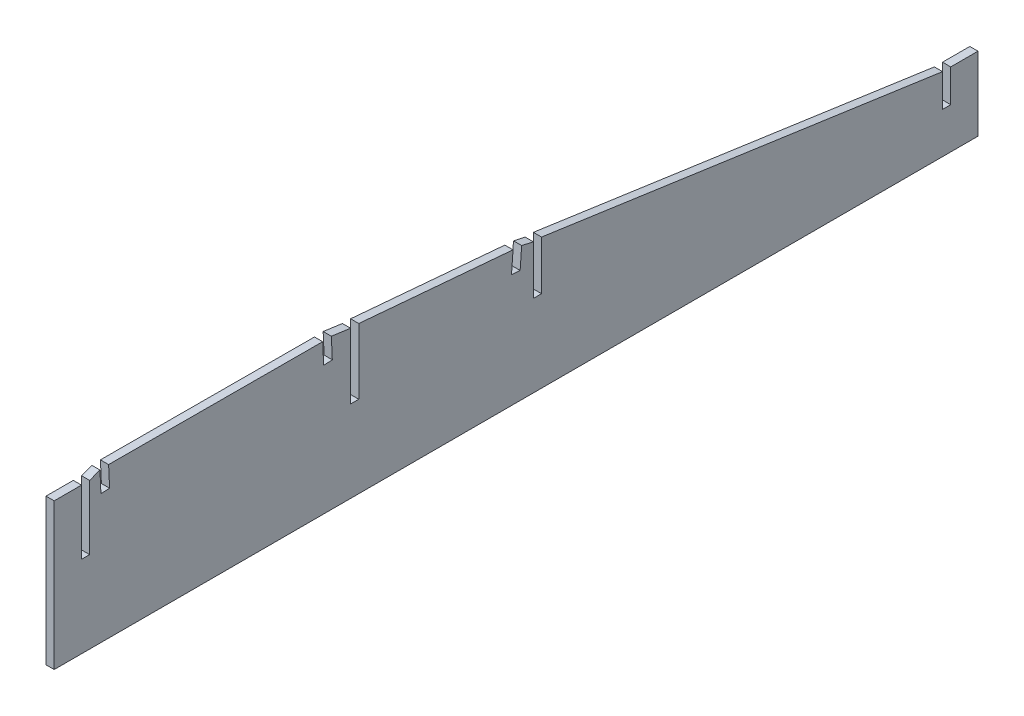
ISO-10303-21;
HEADER;
FILE_DESCRIPTION(('STEP AP214'),'2;1');
FILE_NAME('part.step','',(''),(''),'','','');
FILE_SCHEMA(('AUTOMOTIVE_DESIGN { 1 0 10303 214 1 1 1 1 }'));
ENDSEC;
DATA;
#1=APPLICATION_CONTEXT('core data for automotive mechanical design processes');
#2=APPLICATION_PROTOCOL_DEFINITION('international standard','automotive_design',2000,#1);
#3=PRODUCT_CONTEXT('',#1,'mechanical');
#4=PRODUCT('Part','Part','',(#3));
#5=PRODUCT_RELATED_PRODUCT_CATEGORY('part','',(#4));
#6=PRODUCT_DEFINITION_FORMATION('','',#4);
#7=PRODUCT_DEFINITION_CONTEXT('part definition',#1,'design');
#8=PRODUCT_DEFINITION('design','',#6,#7);
#9=PRODUCT_DEFINITION_SHAPE('','',#8);
#10=(LENGTH_UNIT() NAMED_UNIT(*) SI_UNIT(.MILLI.,.METRE.));
#11=(NAMED_UNIT(*) PLANE_ANGLE_UNIT() SI_UNIT($,.RADIAN.));
#12=(NAMED_UNIT(*) SI_UNIT($,.STERADIAN.) SOLID_ANGLE_UNIT());
#13=UNCERTAINTY_MEASURE_WITH_UNIT(LENGTH_MEASURE(1.E-05),#10,'distance_accuracy_value','');
#14=(GEOMETRIC_REPRESENTATION_CONTEXT(3) GLOBAL_UNCERTAINTY_ASSIGNED_CONTEXT((#13)) GLOBAL_UNIT_ASSIGNED_CONTEXT((#10,
#11,#12)) REPRESENTATION_CONTEXT('',''));
#15=CARTESIAN_POINT('',(0.,0.,0.));
#16=DIRECTION('',(0.,0.,1.));
#17=DIRECTION('',(1.,0.,0.));
#18=AXIS2_PLACEMENT_3D('',#15,#16,#17);
#19=CARTESIAN_POINT('',(296.875,70.0057688647873,-257.342966201798));
#20=DIRECTION('',(0.,0.937794060032995,0.347192023190095));
#21=DIRECTION('',(0.,-0.347192023190095,0.937794060032995));
#22=AXIS2_PLACEMENT_3D('',#19,#20,#21);
#23=PLANE('',#22);
#24=DIRECTION('',(0.,-0.347192023190095,0.937794060032995));
#25=VECTOR('',#24,1.);
#26=CARTESIAN_POINT('',(299.875,70.0057688647873,-257.342966201798));
#27=LINE('',#26,#25);
#28=CARTESIAN_POINT('',(299.875,71.404391483129,-261.120760321769));
#29=VERTEX_POINT('',#28);
#30=CARTESIAN_POINT('',(299.875,70.0057688647873,-257.342966201798));
#31=VERTEX_POINT('',#30);
#32=EDGE_CURVE('E274',#29,#31,#27,.T.);
#33=ORIENTED_EDGE('',*,*,#32,.F.);
#34=DIRECTION('',(1.,0.,0.));
#35=VECTOR('',#34,1.);
#36=CARTESIAN_POINT('',(296.875,71.404391483129,-261.120760321769));
#37=LINE('',#36,#35);
#38=CARTESIAN_POINT('',(296.875,71.404391483129,-261.120760321769));
#39=VERTEX_POINT('',#38);
#40=EDGE_CURVE('E11',#39,#29,#37,.T.);
#41=ORIENTED_EDGE('',*,*,#40,.F.);
#42=DIRECTION('',(0.,-0.347192023190095,0.937794060032995));
#43=VECTOR('',#42,1.);
#44=CARTESIAN_POINT('',(296.875,70.0057688647873,-257.342966201798));
#45=LINE('',#44,#43);
#46=CARTESIAN_POINT('',(296.875,70.0057688647873,-257.342966201798));
#47=VERTEX_POINT('',#46);
#48=EDGE_CURVE('E366',#39,#47,#45,.T.);
#49=ORIENTED_EDGE('',*,*,#48,.T.);
#50=DIRECTION('',(1.,0.,0.));
#51=VECTOR('',#50,1.);
#52=CARTESIAN_POINT('',(296.875,70.0057688647873,-257.342966201798));
#53=LINE('',#52,#51);
#54=EDGE_CURVE('E36',#47,#31,#53,.T.);
#55=ORIENTED_EDGE('',*,*,#54,.T.);
#56=EDGE_LOOP('',(#33,#41,#49,#55));
#57=FACE_BOUND('',#56,.T.);
#58=ADVANCED_FACE('F33',(#57),#23,.T.);
#59=CARTESIAN_POINT('',(296.875,63.7075916354395,-261.478925383067));
#60=DIRECTION('',(0.,0.0464839809617224,-0.998919035514866));
#61=DIRECTION('',(0.,0.998919035514866,0.0464839809617224));
#62=AXIS2_PLACEMENT_3D('',#59,#60,#61);
#63=PLANE('',#62);
#64=DIRECTION('',(0.,0.998919035514866,0.0464839809617224));
#65=VECTOR('',#64,1.);
#66=CARTESIAN_POINT('',(299.875,63.7075916354395,-261.478925383067));
#67=LINE('',#66,#65);
#68=CARTESIAN_POINT('',(299.875,63.7075916354395,-261.478925383067));
#69=VERTEX_POINT('',#68);
#70=EDGE_CURVE('E364',#69,#29,#67,.T.);
#71=ORIENTED_EDGE('',*,*,#70,.F.);
#72=DIRECTION('',(1.,0.,0.));
#73=VECTOR('',#72,1.);
#74=CARTESIAN_POINT('',(296.875,63.7075916354395,-261.478925383067));
#75=LINE('',#74,#73);
#76=CARTESIAN_POINT('',(296.875,63.7075916354395,-261.478925383067));
#77=VERTEX_POINT('',#76);
#78=EDGE_CURVE('E42',#77,#69,#75,.T.);
#79=ORIENTED_EDGE('',*,*,#78,.F.);
#80=DIRECTION('',(0.,0.998919035514866,0.0464839809617224));
#81=VECTOR('',#80,1.);
#82=CARTESIAN_POINT('',(296.875,63.7075916354395,-261.478925383067));
#83=LINE('',#82,#81);
#84=EDGE_CURVE('E264',#77,#39,#83,.T.);
#85=ORIENTED_EDGE('',*,*,#84,.T.);
#86=ORIENTED_EDGE('',*,*,#40,.T.);
#87=EDGE_LOOP('',(#71,#79,#85,#86));
#88=FACE_BOUND('',#87,.T.);
#89=ADVANCED_FACE('F426',(#88),#63,.T.);
#90=CARTESIAN_POINT('',(296.875,63.7075916354395,-261.478925383067));
#91=DIRECTION('',(0.,0.998919219508705,0.0464800268515444));
#92=DIRECTION('',(0.,-0.0464800268515444,0.998919219508705));
#93=AXIS2_PLACEMENT_3D('',#90,#91,#92);
#94=PLANE('',#93);
#95=DIRECTION('',(0.,-0.0464800268515444,0.998919219508705));
#96=VECTOR('',#95,1.);
#97=CARTESIAN_POINT('',(299.875,63.7075916354395,-261.478925383067));
#98=LINE('',#97,#96);
#99=CARTESIAN_POINT('',(299.875,63.8551657207983,-264.650493907267));
#100=VERTEX_POINT('',#99);
#101=EDGE_CURVE('E251',#100,#69,#98,.T.);
#102=ORIENTED_EDGE('',*,*,#101,.F.);
#103=DIRECTION('',(1.,0.,0.));
#104=VECTOR('',#103,1.);
#105=CARTESIAN_POINT('',(296.875,63.8551657207983,-264.650493907267));
#106=LINE('',#105,#104);
#107=CARTESIAN_POINT('',(296.875,63.8551657207983,-264.650493907267));
#108=VERTEX_POINT('',#107);
#109=EDGE_CURVE('E246',#108,#100,#106,.T.);
#110=ORIENTED_EDGE('',*,*,#109,.F.);
#111=DIRECTION('',(0.,-0.0464800268515444,0.998919219508705));
#112=VECTOR('',#111,1.);
#113=CARTESIAN_POINT('',(296.875,63.7075916354395,-261.478925383067));
#114=LINE('',#113,#112);
#115=EDGE_CURVE('E249',#108,#77,#114,.T.);
#116=ORIENTED_EDGE('',*,*,#115,.T.);
#117=ORIENTED_EDGE('',*,*,#78,.T.);
#118=EDGE_LOOP('',(#102,#110,#116,#117));
#119=FACE_BOUND('',#118,.T.);
#120=ADVANCED_FACE('F248',(#119),#94,.T.);
#121=CARTESIAN_POINT('',(296.875,63.8551657207983,-264.650493907267));
#122=DIRECTION('',(0.,-0.0464839809616975,0.998919035514867));
#123=DIRECTION('',(0.,-0.998919035514867,-0.0464839809616975));
#124=AXIS2_PLACEMENT_3D('',#121,#122,#123);
#125=PLANE('',#124);
#126=DIRECTION('',(0.,-0.998919035514867,-0.0464839809616975));
#127=VECTOR('',#126,1.);
#128=CARTESIAN_POINT('',(299.875,63.8551657207983,-264.650493907267));
#129=LINE('',#128,#127);
#130=CARTESIAN_POINT('',(299.875,71.5519651854514,-264.292328863794));
#131=VERTEX_POINT('',#130);
#132=EDGE_CURVE('E361',#131,#100,#129,.T.);
#133=ORIENTED_EDGE('',*,*,#132,.F.);
#134=DIRECTION('',(1.,0.,0.));
#135=VECTOR('',#134,1.);
#136=CARTESIAN_POINT('',(296.875,71.5519651854514,-264.292328863794));
#137=LINE('',#136,#135);
#138=CARTESIAN_POINT('',(296.875,71.5519651854514,-264.292328863794));
#139=VERTEX_POINT('',#138);
#140=EDGE_CURVE('E256',#139,#131,#137,.T.);
#141=ORIENTED_EDGE('',*,*,#140,.F.);
#142=DIRECTION('',(0.,-0.998919035514867,-0.0464839809616975));
#143=VECTOR('',#142,1.);
#144=CARTESIAN_POINT('',(296.875,63.8551657207983,-264.650493907267));
#145=LINE('',#144,#143);
#146=EDGE_CURVE('E262',#139,#108,#145,.T.);
#147=ORIENTED_EDGE('',*,*,#146,.T.);
#148=ORIENTED_EDGE('',*,*,#109,.T.);
#149=EDGE_LOOP('',(#133,#141,#147,#148));
#150=FACE_BOUND('',#149,.T.);
#151=ADVANCED_FACE('F266',(#150),#125,.T.);
#152=CARTESIAN_POINT('',(296.875,71.5519651854514,-264.292328863794));
#153=DIRECTION('',(0.,0.999995706466533,-0.00293036661511788));
#154=DIRECTION('',(0.,0.00293036661511788,0.999995706466533));
#155=AXIS2_PLACEMENT_3D('',#152,#153,#154);
#156=PLANE('',#155);
#157=DIRECTION('',(0.,0.00293036661511788,0.999995706466533));
#158=VECTOR('',#157,1.);
#159=CARTESIAN_POINT('',(299.875,71.5519651854514,-264.292328863794));
#160=LINE('',#159,#158);
#161=CARTESIAN_POINT('',(299.875,71.3219901959792,-342.771929634712));
#162=VERTEX_POINT('',#161);
#163=EDGE_CURVE('E358',#162,#131,#160,.T.);
#164=ORIENTED_EDGE('',*,*,#163,.F.);
#165=DIRECTION('',(1.,0.,0.));
#166=VECTOR('',#165,1.);
#167=CARTESIAN_POINT('',(296.875,71.3219901959792,-342.771929634712));
#168=LINE('',#167,#166);
#169=CARTESIAN_POINT('',(296.875,71.3219901959792,-342.771929634712));
#170=VERTEX_POINT('',#169);
#171=EDGE_CURVE('E370',#170,#162,#168,.T.);
#172=ORIENTED_EDGE('',*,*,#171,.F.);
#173=DIRECTION('',(0.,0.00293036661511788,0.999995706466533));
#174=VECTOR('',#173,1.);
#175=CARTESIAN_POINT('',(296.875,71.5519651854514,-264.292328863794));
#176=LINE('',#175,#174);
#177=EDGE_CURVE('E267',#170,#139,#176,.T.);
#178=ORIENTED_EDGE('',*,*,#177,.T.);
#179=ORIENTED_EDGE('',*,*,#140,.T.);
#180=EDGE_LOOP('',(#164,#172,#178,#179));
#181=FACE_BOUND('',#180,.T.);
#182=ADVANCED_FACE('F439',(#181),#156,.T.);
#183=CARTESIAN_POINT('',(296.875,63.650911904459,-343.128897761839));
#184=DIRECTION('',(0.,0.0464839809617224,-0.998919035514866));
#185=DIRECTION('',(0.,0.998919035514866,0.0464839809617224));
#186=AXIS2_PLACEMENT_3D('',#183,#184,#185);
#187=PLANE('',#186);
#188=DIRECTION('',(0.,0.998919035514866,0.0464839809617224));
#189=VECTOR('',#188,1.);
#190=CARTESIAN_POINT('',(299.875,63.650911904459,-343.128897761839));
#191=LINE('',#190,#189);
#192=CARTESIAN_POINT('',(299.875,63.650911904459,-343.128897761839));
#193=VERTEX_POINT('',#192);
#194=EDGE_CURVE('E355',#193,#162,#191,.T.);
#195=ORIENTED_EDGE('',*,*,#194,.F.);
#196=DIRECTION('',(1.,0.,0.));
#197=VECTOR('',#196,1.);
#198=CARTESIAN_POINT('',(296.875,63.650911904459,-343.128897761839));
#199=LINE('',#198,#197);
#200=CARTESIAN_POINT('',(296.875,63.650911904459,-343.128897761839));
#201=VERTEX_POINT('',#200);
#202=EDGE_CURVE('E372',#201,#193,#199,.T.);
#203=ORIENTED_EDGE('',*,*,#202,.F.);
#204=DIRECTION('',(0.,0.998919035514866,0.0464839809617224));
#205=VECTOR('',#204,1.);
#206=CARTESIAN_POINT('',(296.875,63.650911904459,-343.128897761839));
#207=LINE('',#206,#205);
#208=EDGE_CURVE('E269',#201,#170,#207,.T.);
#209=ORIENTED_EDGE('',*,*,#208,.T.);
#210=ORIENTED_EDGE('',*,*,#171,.T.);
#211=EDGE_LOOP('',(#195,#203,#209,#210));
#212=FACE_BOUND('',#211,.T.);
#213=ADVANCED_FACE('F442',(#212),#187,.T.);
#214=CARTESIAN_POINT('',(296.875,63.650911904459,-343.128897761839));
#215=DIRECTION('',(0.,0.998919034759445,0.0464839971953607));
#216=DIRECTION('',(0.,-0.0464839971953607,0.998919034759445));
#217=AXIS2_PLACEMENT_3D('',#214,#215,#216);
#218=PLANE('',#217);
#219=DIRECTION('',(0.,-0.0464839971953607,0.998919034759445));
#220=VECTOR('',#219,1.);
#221=CARTESIAN_POINT('',(299.875,63.650911904459,-343.128897761839));
#222=LINE('',#221,#220);
#223=CARTESIAN_POINT('',(299.875,63.7984985956583,-346.300465699436));
#224=VERTEX_POINT('',#223);
#225=EDGE_CURVE('E352',#224,#193,#222,.T.);
#226=ORIENTED_EDGE('',*,*,#225,.F.);
#227=DIRECTION('',(1.,0.,0.));
#228=VECTOR('',#227,1.);
#229=CARTESIAN_POINT('',(296.875,63.7984985956583,-346.300465699436));
#230=LINE('',#229,#228);
#231=CARTESIAN_POINT('',(296.875,63.7984985956583,-346.300465699436));
#232=VERTEX_POINT('',#231);
#233=EDGE_CURVE('E374',#232,#224,#230,.T.);
#234=ORIENTED_EDGE('',*,*,#233,.F.);
#235=DIRECTION('',(0.,-0.0464839971953607,0.998919034759445));
#236=VECTOR('',#235,1.);
#237=CARTESIAN_POINT('',(296.875,63.650911904459,-343.128897761839));
#238=LINE('',#237,#236);
#239=EDGE_CURVE('E845',#232,#201,#238,.T.);
#240=ORIENTED_EDGE('',*,*,#239,.T.);
#241=ORIENTED_EDGE('',*,*,#202,.T.);
#242=EDGE_LOOP('',(#226,#234,#240,#241));
#243=FACE_BOUND('',#242,.T.);
#244=ADVANCED_FACE('F446',(#243),#218,.T.);
#245=CARTESIAN_POINT('',(296.875,63.7984985956583,-346.300465699436));
#246=DIRECTION('',(0.,-0.0464839809617478,0.998919035514865));
#247=DIRECTION('',(0.,-0.998919035514865,-0.0464839809617478));
#248=AXIS2_PLACEMENT_3D('',#245,#246,#247);
#249=PLANE('',#248);
#250=DIRECTION('',(0.,-0.998919035514865,-0.0464839809617478));
#251=VECTOR('',#250,1.);
#252=CARTESIAN_POINT('',(299.875,63.7984985956583,-346.300465699436));
#253=LINE('',#252,#251);
#254=CARTESIAN_POINT('',(299.875,71.4695768619431,-345.943497573483));
#255=VERTEX_POINT('',#254);
#256=EDGE_CURVE('E349',#255,#224,#253,.T.);
#257=ORIENTED_EDGE('',*,*,#256,.F.);
#258=DIRECTION('',(1.,0.,0.));
#259=VECTOR('',#258,1.);
#260=CARTESIAN_POINT('',(296.875,71.4695768619431,-345.943497573483));
#261=LINE('',#260,#259);
#262=CARTESIAN_POINT('',(296.875,71.4695768619431,-345.943497573483));
#263=VERTEX_POINT('',#262);
#264=EDGE_CURVE('E376',#263,#255,#261,.T.);
#265=ORIENTED_EDGE('',*,*,#264,.F.);
#266=DIRECTION('',(0.,-0.998919035514865,-0.0464839809617478));
#267=VECTOR('',#266,1.);
#268=CARTESIAN_POINT('',(296.875,63.7984985956583,-346.300465699436));
#269=LINE('',#268,#267);
#270=EDGE_CURVE('E838',#263,#232,#269,.T.);
#271=ORIENTED_EDGE('',*,*,#270,.T.);
#272=ORIENTED_EDGE('',*,*,#233,.T.);
#273=EDGE_LOOP('',(#257,#265,#271,#272));
#274=FACE_BOUND('',#273,.T.);
#275=ADVANCED_FACE('F450',(#274),#249,.T.);
#276=CARTESIAN_POINT('',(296.875,71.4695768619431,-345.943497573483));
#277=DIRECTION('',(0.,0.990255952341199,-0.139259286415034));
#278=DIRECTION('',(0.,0.139259286415034,0.990255952341199));
#279=AXIS2_PLACEMENT_3D('',#276,#277,#278);
#280=PLANE('',#279);
#281=DIRECTION('',(0.,0.139259286415034,0.990255952341199));
#282=VECTOR('',#281,1.);
#283=CARTESIAN_POINT('',(299.875,71.4695768619431,-345.943497573483));
#284=LINE('',#283,#282);
#285=CARTESIAN_POINT('',(299.875,70.4772238342441,-353.));
#286=VERTEX_POINT('',#285);
#287=EDGE_CURVE('E346',#286,#255,#284,.T.);
#288=ORIENTED_EDGE('',*,*,#287,.F.);
#289=DIRECTION('',(1.,0.,0.));
#290=VECTOR('',#289,1.);
#291=CARTESIAN_POINT('',(296.875,70.4772238342441,-353.));
#292=LINE('',#291,#290);
#293=CARTESIAN_POINT('',(296.875,70.4772238342441,-353.));
#294=VERTEX_POINT('',#293);
#295=EDGE_CURVE('E378',#294,#286,#292,.T.);
#296=ORIENTED_EDGE('',*,*,#295,.F.);
#297=DIRECTION('',(0.,0.139259286415034,0.990255952341199));
#298=VECTOR('',#297,1.);
#299=CARTESIAN_POINT('',(296.875,71.4695768619431,-345.943497573483));
#300=LINE('',#299,#298);
#301=EDGE_CURVE('E834',#294,#263,#300,.T.);
#302=ORIENTED_EDGE('',*,*,#301,.T.);
#303=ORIENTED_EDGE('',*,*,#264,.T.);
#304=EDGE_LOOP('',(#288,#296,#302,#303));
#305=FACE_BOUND('',#304,.T.);
#306=ADVANCED_FACE('F454',(#305),#280,.T.);
#307=CARTESIAN_POINT('',(296.875,70.4772238342441,-353.));
#308=DIRECTION('',(0.,0.,-1.));
#309=DIRECTION('',(-1.,0.,0.));
#310=AXIS2_PLACEMENT_3D('',#307,#308,#309);
#311=PLANE('',#310);
#312=DIRECTION('',(0.,1.,0.));
#313=VECTOR('',#312,1.);
#314=CARTESIAN_POINT('',(299.875,70.4772238342441,-353.));
#315=LINE('',#314,#313);
#316=CARTESIAN_POINT('',(299.875,46.4388254453726,-353.));
#317=VERTEX_POINT('',#316);
#318=EDGE_CURVE('E343',#317,#286,#315,.T.);
#319=ORIENTED_EDGE('',*,*,#318,.F.);
#320=DIRECTION('',(1.,0.,0.));
#321=VECTOR('',#320,1.);
#322=CARTESIAN_POINT('',(296.875,46.4388254453726,-353.));
#323=LINE('',#322,#321);
#324=CARTESIAN_POINT('',(296.875,46.4388254453726,-353.));
#325=VERTEX_POINT('',#324);
#326=EDGE_CURVE('E380',#325,#317,#323,.T.);
#327=ORIENTED_EDGE('',*,*,#326,.F.);
#328=DIRECTION('',(0.,1.,0.));
#329=VECTOR('',#328,1.);
#330=CARTESIAN_POINT('',(296.875,70.4772238342441,-353.));
#331=LINE('',#330,#329);
#332=EDGE_CURVE('E850',#325,#294,#331,.T.);
#333=ORIENTED_EDGE('',*,*,#332,.T.);
#334=ORIENTED_EDGE('',*,*,#295,.T.);
#335=EDGE_LOOP('',(#319,#327,#333,#334));
#336=FACE_BOUND('',#335,.T.);
#337=ADVANCED_FACE('F458',(#336),#311,.T.);
#338=CARTESIAN_POINT('',(296.875,46.4388254453726,-356.));
#339=DIRECTION('',(0.,1.,0.));
#340=DIRECTION('',(0.,0.,1.));
#341=AXIS2_PLACEMENT_3D('',#338,#339,#340);
#342=PLANE('',#341);
#343=DIRECTION('',(0.,0.,1.));
#344=VECTOR('',#343,1.);
#345=CARTESIAN_POINT('',(299.875,46.4388254453726,-356.));
#346=LINE('',#345,#344);
#347=CARTESIAN_POINT('',(299.875,46.4388254453726,-356.));
#348=VERTEX_POINT('',#347);
#349=EDGE_CURVE('E340',#348,#317,#346,.T.);
#350=ORIENTED_EDGE('',*,*,#349,.F.);
#351=DIRECTION('',(1.,0.,0.));
#352=VECTOR('',#351,1.);
#353=CARTESIAN_POINT('',(296.875,46.4388254453726,-356.));
#354=LINE('',#353,#352);
#355=CARTESIAN_POINT('',(296.875,46.4388254453726,-356.));
#356=VERTEX_POINT('',#355);
#357=EDGE_CURVE('E382',#356,#348,#354,.T.);
#358=ORIENTED_EDGE('',*,*,#357,.F.);
#359=DIRECTION('',(0.,0.,1.));
#360=VECTOR('',#359,1.);
#361=CARTESIAN_POINT('',(296.875,46.4388254453726,-356.));
#362=LINE('',#361,#360);
#363=EDGE_CURVE('E827',#356,#325,#362,.T.);
#364=ORIENTED_EDGE('',*,*,#363,.T.);
#365=ORIENTED_EDGE('',*,*,#326,.T.);
#366=EDGE_LOOP('',(#350,#358,#364,#365));
#367=FACE_BOUND('',#366,.T.);
#368=ADVANCED_FACE('F462',(#367),#342,.T.);
#369=CARTESIAN_POINT('',(296.875,70.4772238342441,-356.));
#370=DIRECTION('',(0.,0.,1.));
#371=DIRECTION('',(1.,0.,0.));
#372=AXIS2_PLACEMENT_3D('',#369,#370,#371);
#373=PLANE('',#372);
#374=DIRECTION('',(0.,-1.,0.));
#375=VECTOR('',#374,1.);
#376=CARTESIAN_POINT('',(299.875,70.4772238342441,-356.));
#377=LINE('',#376,#375);
#378=CARTESIAN_POINT('',(299.875,70.4772238342441,-356.));
#379=VERTEX_POINT('',#378);
#380=EDGE_CURVE('E337',#379,#348,#377,.T.);
#381=ORIENTED_EDGE('',*,*,#380,.F.);
#382=DIRECTION('',(1.,0.,0.));
#383=VECTOR('',#382,1.);
#384=CARTESIAN_POINT('',(296.875,70.4772238342441,-356.));
#385=LINE('',#384,#383);
#386=CARTESIAN_POINT('',(296.875,70.4772238342441,-356.));
#387=VERTEX_POINT('',#386);
#388=EDGE_CURVE('E384',#387,#379,#385,.T.);
#389=ORIENTED_EDGE('',*,*,#388,.F.);
#390=DIRECTION('',(0.,-1.,0.));
#391=VECTOR('',#390,1.);
#392=CARTESIAN_POINT('',(296.875,70.4772238342441,-356.));
#393=LINE('',#392,#391);
#394=EDGE_CURVE('E823',#387,#356,#393,.T.);
#395=ORIENTED_EDGE('',*,*,#394,.T.);
#396=ORIENTED_EDGE('',*,*,#357,.T.);
#397=EDGE_LOOP('',(#381,#389,#395,#396));
#398=FACE_BOUND('',#397,.T.);
#399=ADVANCED_FACE('F466',(#398),#373,.T.);
#400=CARTESIAN_POINT('',(296.875,70.4772238342441,-356.));
#401=DIRECTION('',(0.,0.996302304157887,-0.08591692923799));
#402=DIRECTION('',(0.,0.08591692923799,0.996302304157887));
#403=AXIS2_PLACEMENT_3D('',#400,#401,#402);
#404=PLANE('',#403);
#405=DIRECTION('',(0.,0.08591692923799,0.996302304157887));
#406=VECTOR('',#405,1.);
#407=CARTESIAN_POINT('',(299.875,70.4772238342441,-356.));
#408=LINE('',#407,#406);
#409=CARTESIAN_POINT('',(299.875,65.6008014189821,-412.547538784992));
#410=VERTEX_POINT('',#409);
#411=EDGE_CURVE('E334',#410,#379,#408,.T.);
#412=ORIENTED_EDGE('',*,*,#411,.F.);
#413=DIRECTION('',(1.,0.,0.));
#414=VECTOR('',#413,1.);
#415=CARTESIAN_POINT('',(296.875,65.6008014189821,-412.547538784992));
#416=LINE('',#415,#414);
#417=CARTESIAN_POINT('',(296.875,65.6008014189821,-412.547538784992));
#418=VERTEX_POINT('',#417);
#419=EDGE_CURVE('E386',#418,#410,#416,.T.);
#420=ORIENTED_EDGE('',*,*,#419,.F.);
#421=DIRECTION('',(0.,0.08591692923799,0.996302304157887));
#422=VECTOR('',#421,1.);
#423=CARTESIAN_POINT('',(296.875,70.4772238342441,-356.));
#424=LINE('',#423,#422);
#425=EDGE_CURVE('E854',#418,#387,#424,.T.);
#426=ORIENTED_EDGE('',*,*,#425,.T.);
#427=ORIENTED_EDGE('',*,*,#388,.T.);
#428=EDGE_LOOP('',(#412,#420,#426,#427));
#429=FACE_BOUND('',#428,.T.);
#430=ADVANCED_FACE('F470',(#429),#404,.T.);
#431=CARTESIAN_POINT('',(296.875,57.9790890075127,-411.981466052959));
#432=DIRECTION('',(0.,-0.0740670663478967,-0.997253262558021));
#433=DIRECTION('',(0.,0.997253262558021,-0.0740670663478967));
#434=AXIS2_PLACEMENT_3D('',#431,#432,#433);
#435=PLANE('',#434);
#436=DIRECTION('',(0.,0.99725326255802,-0.0740670663478967));
#437=VECTOR('',#436,1.);
#438=CARTESIAN_POINT('',(299.875,57.9790890075127,-411.981466052959));
#439=LINE('',#438,#437);
#440=CARTESIAN_POINT('',(299.875,57.9790890075127,-411.981466052959));
#441=VERTEX_POINT('',#440);
#442=EDGE_CURVE('E331',#441,#410,#439,.T.);
#443=ORIENTED_EDGE('',*,*,#442,.F.);
#444=DIRECTION('',(1.,0.,0.));
#445=VECTOR('',#444,1.);
#446=CARTESIAN_POINT('',(296.875,57.9790890075127,-411.981466052959));
#447=LINE('',#446,#445);
#448=CARTESIAN_POINT('',(296.875,57.9790890075127,-411.981466052959));
#449=VERTEX_POINT('',#448);
#450=EDGE_CURVE('E388',#449,#441,#447,.T.);
#451=ORIENTED_EDGE('',*,*,#450,.F.);
#452=DIRECTION('',(0.,0.99725326255802,-0.0740670663478967));
#453=VECTOR('',#452,1.);
#454=CARTESIAN_POINT('',(296.875,57.9790890075127,-411.981466052959));
#455=LINE('',#454,#453);
#456=EDGE_CURVE('E816',#449,#418,#455,.T.);
#457=ORIENTED_EDGE('',*,*,#456,.T.);
#458=ORIENTED_EDGE('',*,*,#419,.T.);
#459=EDGE_LOOP('',(#443,#451,#457,#458));
#460=FACE_BOUND('',#459,.T.);
#461=ADVANCED_FACE('F474',(#460),#435,.T.);
#462=CARTESIAN_POINT('',(296.875,57.7439260718582,-415.147745161581));
#463=DIRECTION('',(0.,0.997253262558021,-0.074067066347891));
#464=DIRECTION('',(0.,0.074067066347891,0.997253262558021));
#465=AXIS2_PLACEMENT_3D('',#462,#463,#464);
#466=PLANE('',#465);
#467=DIRECTION('',(0.,0.0740670663478909,0.997253262558021));
#468=VECTOR('',#467,1.);
#469=CARTESIAN_POINT('',(299.875,57.7439260718582,-415.147745161581));
#470=LINE('',#469,#468);
#471=CARTESIAN_POINT('',(299.875,57.7439260718582,-415.147745161581));
#472=VERTEX_POINT('',#471);
#473=EDGE_CURVE('E328',#472,#441,#470,.T.);
#474=ORIENTED_EDGE('',*,*,#473,.F.);
#475=DIRECTION('',(1.,0.,0.));
#476=VECTOR('',#475,1.);
#477=CARTESIAN_POINT('',(296.875,57.7439260718582,-415.147745161581));
#478=LINE('',#477,#476);
#479=CARTESIAN_POINT('',(296.875,57.7439260718582,-415.147745161581));
#480=VERTEX_POINT('',#479);
#481=EDGE_CURVE('E390',#480,#472,#478,.T.);
#482=ORIENTED_EDGE('',*,*,#481,.F.);
#483=DIRECTION('',(0.,0.0740670663478909,0.997253262558021));
#484=VECTOR('',#483,1.);
#485=CARTESIAN_POINT('',(296.875,57.7439260718582,-415.147745161581));
#486=LINE('',#485,#484);
#487=EDGE_CURVE('E812',#480,#449,#486,.T.);
#488=ORIENTED_EDGE('',*,*,#487,.T.);
#489=ORIENTED_EDGE('',*,*,#450,.T.);
#490=EDGE_LOOP('',(#474,#482,#488,#489));
#491=FACE_BOUND('',#490,.T.);
#492=ADVANCED_FACE('F478',(#491),#466,.T.);
#493=CARTESIAN_POINT('',(296.875,57.7439260718582,-415.147745161581));
#494=DIRECTION('',(0.,0.0740670663478894,0.997253262558021));
#495=DIRECTION('',(0.,-0.997253262558021,0.0740670663478895));
#496=AXIS2_PLACEMENT_3D('',#493,#494,#495);
#497=PLANE('',#496);
#498=DIRECTION('',(0.,-0.997253262558021,0.0740670663478894));
#499=VECTOR('',#498,1.);
#500=CARTESIAN_POINT('',(299.875,57.7439260718582,-415.147745161581));
#501=LINE('',#500,#499);
#502=CARTESIAN_POINT('',(299.875,65.36563978013,-415.713817989928));
#503=VERTEX_POINT('',#502);
#504=EDGE_CURVE('E325',#503,#472,#501,.T.);
#505=ORIENTED_EDGE('',*,*,#504,.F.);
#506=DIRECTION('',(1.,0.,0.));
#507=VECTOR('',#506,1.);
#508=CARTESIAN_POINT('',(296.875,65.36563978013,-415.713817989928));
#509=LINE('',#508,#507);
#510=CARTESIAN_POINT('',(296.875,65.36563978013,-415.713817989928));
#511=VERTEX_POINT('',#510);
#512=EDGE_CURVE('E392',#511,#503,#509,.T.);
#513=ORIENTED_EDGE('',*,*,#512,.F.);
#514=DIRECTION('',(0.,-0.997253262558021,0.0740670663478894));
#515=VECTOR('',#514,1.);
#516=CARTESIAN_POINT('',(296.875,57.7439260718582,-415.147745161581));
#517=LINE('',#516,#515);
#518=EDGE_CURVE('E858',#511,#480,#517,.T.);
#519=ORIENTED_EDGE('',*,*,#518,.T.);
#520=ORIENTED_EDGE('',*,*,#481,.T.);
#521=EDGE_LOOP('',(#505,#513,#519,#520));
#522=FACE_BOUND('',#521,.T.);
#523=ADVANCED_FACE('F482',(#522),#497,.T.);
#524=CARTESIAN_POINT('',(296.875,65.36563978013,-415.713817989928));
#525=DIRECTION('',(0.,0.976676739439343,-0.214715035892074));
#526=DIRECTION('',(0.,0.214715035892074,0.976676739439343));
#527=AXIS2_PLACEMENT_3D('',#524,#525,#526);
#528=PLANE('',#527);
#529=DIRECTION('',(0.,0.214715035892074,0.976676739439343));
#530=VECTOR('',#529,1.);
#531=CARTESIAN_POINT('',(299.875,65.36563978013,-415.713817989928));
#532=LINE('',#531,#530);
#533=CARTESIAN_POINT('',(299.875,64.423354900221,-420.));
#534=VERTEX_POINT('',#533);
#535=EDGE_CURVE('E322',#534,#503,#532,.T.);
#536=ORIENTED_EDGE('',*,*,#535,.F.);
#537=DIRECTION('',(1.,0.,0.));
#538=VECTOR('',#537,1.);
#539=CARTESIAN_POINT('',(296.875,64.423354900221,-420.));
#540=LINE('',#539,#538);
#541=CARTESIAN_POINT('',(296.875,64.423354900221,-420.));
#542=VERTEX_POINT('',#541);
#543=EDGE_CURVE('E394',#542,#534,#540,.T.);
#544=ORIENTED_EDGE('',*,*,#543,.F.);
#545=DIRECTION('',(0.,0.214715035892074,0.976676739439343));
#546=VECTOR('',#545,1.);
#547=CARTESIAN_POINT('',(296.875,65.36563978013,-415.713817989928));
#548=LINE('',#547,#546);
#549=EDGE_CURVE('E805',#542,#511,#548,.T.);
#550=ORIENTED_EDGE('',*,*,#549,.T.);
#551=ORIENTED_EDGE('',*,*,#512,.T.);
#552=EDGE_LOOP('',(#536,#544,#550,#551));
#553=FACE_BOUND('',#552,.T.);
#554=ADVANCED_FACE('F486',(#553),#528,.T.);
#555=CARTESIAN_POINT('',(296.875,46.4388254453726,-420.));
#556=DIRECTION('',(0.,0.,-1.));
#557=DIRECTION('',(-1.,0.,0.));
#558=AXIS2_PLACEMENT_3D('',#555,#556,#557);
#559=PLANE('',#558);
#560=DIRECTION('',(0.,1.,0.));
#561=VECTOR('',#560,1.);
#562=CARTESIAN_POINT('',(299.875,46.4388254453726,-420.));
#563=LINE('',#562,#561);
#564=CARTESIAN_POINT('',(299.875,46.4388254453726,-420.));
#565=VERTEX_POINT('',#564);
#566=EDGE_CURVE('E319',#565,#534,#563,.T.);
#567=ORIENTED_EDGE('',*,*,#566,.F.);
#568=DIRECTION('',(1.,0.,0.));
#569=VECTOR('',#568,1.);
#570=CARTESIAN_POINT('',(296.875,46.4388254453726,-420.));
#571=LINE('',#570,#569);
#572=CARTESIAN_POINT('',(296.875,46.4388254453726,-420.));
#573=VERTEX_POINT('',#572);
#574=EDGE_CURVE('E396',#573,#565,#571,.T.);
#575=ORIENTED_EDGE('',*,*,#574,.F.);
#576=DIRECTION('',(0.,1.,0.));
#577=VECTOR('',#576,1.);
#578=CARTESIAN_POINT('',(296.875,46.4388254453726,-420.));
#579=LINE('',#578,#577);
#580=EDGE_CURVE('E801',#573,#542,#579,.T.);
#581=ORIENTED_EDGE('',*,*,#580,.T.);
#582=ORIENTED_EDGE('',*,*,#543,.T.);
#583=EDGE_LOOP('',(#567,#575,#581,#582));
#584=FACE_BOUND('',#583,.T.);
#585=ADVANCED_FACE('F490',(#584),#559,.T.);
#586=CARTESIAN_POINT('',(296.875,46.4388254453726,-423.));
#587=DIRECTION('',(0.,1.,0.));
#588=DIRECTION('',(0.,0.,1.));
#589=AXIS2_PLACEMENT_3D('',#586,#587,#588);
#590=PLANE('',#589);
#591=DIRECTION('',(0.,0.,1.));
#592=VECTOR('',#591,1.);
#593=CARTESIAN_POINT('',(299.875,46.4388254453726,-423.));
#594=LINE('',#593,#592);
#595=CARTESIAN_POINT('',(299.875,46.4388254453726,-423.));
#596=VERTEX_POINT('',#595);
#597=EDGE_CURVE('E316',#596,#565,#594,.T.);
#598=ORIENTED_EDGE('',*,*,#597,.F.);
#599=DIRECTION('',(1.,0.,0.));
#600=VECTOR('',#599,1.);
#601=CARTESIAN_POINT('',(296.875,46.4388254453726,-423.));
#602=LINE('',#601,#600);
#603=CARTESIAN_POINT('',(296.875,46.4388254453726,-423.));
#604=VERTEX_POINT('',#603);
#605=EDGE_CURVE('E398',#604,#596,#602,.T.);
#606=ORIENTED_EDGE('',*,*,#605,.F.);
#607=DIRECTION('',(0.,0.,1.));
#608=VECTOR('',#607,1.);
#609=CARTESIAN_POINT('',(296.875,46.4388254453726,-423.));
#610=LINE('',#609,#608);
#611=EDGE_CURVE('E862',#604,#573,#610,.T.);
#612=ORIENTED_EDGE('',*,*,#611,.T.);
#613=ORIENTED_EDGE('',*,*,#574,.T.);
#614=EDGE_LOOP('',(#598,#606,#612,#613));
#615=FACE_BOUND('',#614,.T.);
#616=ADVANCED_FACE('F494',(#615),#590,.T.);
#617=CARTESIAN_POINT('',(296.875,46.4388254453726,-423.));
#618=DIRECTION('',(0.,0.,1.));
#619=DIRECTION('',(1.,0.,0.));
#620=AXIS2_PLACEMENT_3D('',#617,#618,#619);
#621=PLANE('',#620);
#622=DIRECTION('',(0.,-1.,0.));
#623=VECTOR('',#622,1.);
#624=CARTESIAN_POINT('',(299.875,46.4388254453726,-423.));
#625=LINE('',#624,#623);
#626=CARTESIAN_POINT('',(299.875,64.423354900221,-423.));
#627=VERTEX_POINT('',#626);
#628=EDGE_CURVE('E313',#627,#596,#625,.T.);
#629=ORIENTED_EDGE('',*,*,#628,.F.);
#630=DIRECTION('',(1.,0.,0.));
#631=VECTOR('',#630,1.);
#632=CARTESIAN_POINT('',(296.875,64.423354900221,-423.));
#633=LINE('',#632,#631);
#634=CARTESIAN_POINT('',(296.875,64.423354900221,-423.));
#635=VERTEX_POINT('',#634);
#636=EDGE_CURVE('E400',#635,#627,#633,.T.);
#637=ORIENTED_EDGE('',*,*,#636,.F.);
#638=DIRECTION('',(0.,-1.,0.));
#639=VECTOR('',#638,1.);
#640=CARTESIAN_POINT('',(296.875,46.4388254453726,-423.));
#641=LINE('',#640,#639);
#642=EDGE_CURVE('E794',#635,#604,#641,.T.);
#643=ORIENTED_EDGE('',*,*,#642,.T.);
#644=ORIENTED_EDGE('',*,*,#605,.T.);
#645=EDGE_LOOP('',(#629,#637,#643,#644));
#646=FACE_BOUND('',#645,.T.);
#647=ADVANCED_FACE('F498',(#646),#621,.T.);
#648=CARTESIAN_POINT('',(296.875,64.423354900221,-423.));
#649=DIRECTION('',(0.,0.989968592919205,-0.14128759688511));
#650=DIRECTION('',(0.,0.14128759688511,0.989968592919205));
#651=AXIS2_PLACEMENT_3D('',#648,#649,#650);
#652=PLANE('',#651);
#653=DIRECTION('',(0.,0.14128759688511,0.989968592919205));
#654=VECTOR('',#653,1.);
#655=CARTESIAN_POINT('',(299.875,64.423354900221,-423.));
#656=LINE('',#655,#654);
#657=CARTESIAN_POINT('',(299.875,43.4436219160998,-570.));
#658=VERTEX_POINT('',#657);
#659=EDGE_CURVE('E310',#658,#627,#656,.T.);
#660=ORIENTED_EDGE('',*,*,#659,.F.);
#661=DIRECTION('',(1.,0.,0.));
#662=VECTOR('',#661,1.);
#663=CARTESIAN_POINT('',(296.875,43.4436219160998,-570.));
#664=LINE('',#663,#662);
#665=CARTESIAN_POINT('',(296.875,43.4436219160998,-570.));
#666=VERTEX_POINT('',#665);
#667=EDGE_CURVE('E402',#666,#658,#664,.T.);
#668=ORIENTED_EDGE('',*,*,#667,.F.);
#669=DIRECTION('',(0.,0.14128759688511,0.989968592919205));
#670=VECTOR('',#669,1.);
#671=CARTESIAN_POINT('',(296.875,64.423354900221,-423.));
#672=LINE('',#671,#670);
#673=EDGE_CURVE('E790',#666,#635,#672,.T.);
#674=ORIENTED_EDGE('',*,*,#673,.T.);
#675=ORIENTED_EDGE('',*,*,#636,.T.);
#676=EDGE_LOOP('',(#660,#668,#674,#675));
#677=FACE_BOUND('',#676,.T.);
#678=ADVANCED_FACE('F502',(#677),#652,.T.);
#679=CARTESIAN_POINT('',(296.875,31.4436219160998,-570.));
#680=DIRECTION('',(0.,0.,-1.));
#681=DIRECTION('',(-1.,0.,0.));
#682=AXIS2_PLACEMENT_3D('',#679,#680,#681);
#683=PLANE('',#682);
#684=DIRECTION('',(0.,1.,0.));
#685=VECTOR('',#684,1.);
#686=CARTESIAN_POINT('',(299.875,31.4436219160998,-570.));
#687=LINE('',#686,#685);
#688=CARTESIAN_POINT('',(299.875,31.4436219160998,-570.));
#689=VERTEX_POINT('',#688);
#690=EDGE_CURVE('E307',#689,#658,#687,.T.);
#691=ORIENTED_EDGE('',*,*,#690,.F.);
#692=DIRECTION('',(1.,0.,0.));
#693=VECTOR('',#692,1.);
#694=CARTESIAN_POINT('',(296.875,31.4436219160998,-570.));
#695=LINE('',#694,#693);
#696=CARTESIAN_POINT('',(296.875,31.4436219160998,-570.));
#697=VERTEX_POINT('',#696);
#698=EDGE_CURVE('E404',#697,#689,#695,.T.);
#699=ORIENTED_EDGE('',*,*,#698,.F.);
#700=DIRECTION('',(0.,1.,0.));
#701=VECTOR('',#700,1.);
#702=CARTESIAN_POINT('',(296.875,31.4436219160998,-570.));
#703=LINE('',#702,#701);
#704=EDGE_CURVE('E866',#697,#666,#703,.T.);
#705=ORIENTED_EDGE('',*,*,#704,.T.);
#706=ORIENTED_EDGE('',*,*,#667,.T.);
#707=EDGE_LOOP('',(#691,#699,#705,#706));
#708=FACE_BOUND('',#707,.T.);
#709=ADVANCED_FACE('F506',(#708),#683,.T.);
#710=CARTESIAN_POINT('',(296.875,31.4436219160998,-570.));
#711=DIRECTION('',(0.,1.,0.));
#712=DIRECTION('',(0.,0.,1.));
#713=AXIS2_PLACEMENT_3D('',#710,#711,#712);
#714=PLANE('',#713);
#715=DIRECTION('',(0.,0.,1.));
#716=VECTOR('',#715,1.);
#717=CARTESIAN_POINT('',(299.875,31.4436219160998,-570.));
#718=LINE('',#717,#716);
#719=CARTESIAN_POINT('',(299.875,31.4436219160998,-573.));
#720=VERTEX_POINT('',#719);
#721=EDGE_CURVE('E304',#720,#689,#718,.T.);
#722=ORIENTED_EDGE('',*,*,#721,.F.);
#723=DIRECTION('',(1.,0.,0.));
#724=VECTOR('',#723,1.);
#725=CARTESIAN_POINT('',(296.875,31.4436219160998,-573.));
#726=LINE('',#725,#724);
#727=CARTESIAN_POINT('',(296.875,31.4436219160998,-573.));
#728=VERTEX_POINT('',#727);
#729=EDGE_CURVE('E406',#728,#720,#726,.T.);
#730=ORIENTED_EDGE('',*,*,#729,.F.);
#731=DIRECTION('',(0.,0.,1.));
#732=VECTOR('',#731,1.);
#733=CARTESIAN_POINT('',(296.875,31.4436219160998,-570.));
#734=LINE('',#733,#732);
#735=EDGE_CURVE('E783',#728,#697,#734,.T.);
#736=ORIENTED_EDGE('',*,*,#735,.T.);
#737=ORIENTED_EDGE('',*,*,#698,.T.);
#738=EDGE_LOOP('',(#722,#730,#736,#737));
#739=FACE_BOUND('',#738,.T.);
#740=ADVANCED_FACE('F510',(#739),#714,.T.);
#741=CARTESIAN_POINT('',(296.875,31.4436219160998,-573.));
#742=DIRECTION('',(0.,0.,1.));
#743=DIRECTION('',(1.,0.,0.));
#744=AXIS2_PLACEMENT_3D('',#741,#742,#743);
#745=PLANE('',#744);
#746=DIRECTION('',(0.,-1.,0.));
#747=VECTOR('',#746,1.);
#748=CARTESIAN_POINT('',(299.875,31.4436219160998,-573.));
#749=LINE('',#748,#747);
#750=CARTESIAN_POINT('',(299.875,43.4436219160998,-573.));
#751=VERTEX_POINT('',#750);
#752=EDGE_CURVE('E301',#751,#720,#749,.T.);
#753=ORIENTED_EDGE('',*,*,#752,.F.);
#754=DIRECTION('',(1.,0.,0.));
#755=VECTOR('',#754,1.);
#756=CARTESIAN_POINT('',(296.875,43.4436219160998,-573.));
#757=LINE('',#756,#755);
#758=CARTESIAN_POINT('',(296.875,43.4436219160998,-573.));
#759=VERTEX_POINT('',#758);
#760=EDGE_CURVE('E408',#759,#751,#757,.T.);
#761=ORIENTED_EDGE('',*,*,#760,.F.);
#762=DIRECTION('',(0.,-1.,0.));
#763=VECTOR('',#762,1.);
#764=CARTESIAN_POINT('',(296.875,31.4436219160998,-573.));
#765=LINE('',#764,#763);
#766=EDGE_CURVE('E779',#759,#728,#765,.T.);
#767=ORIENTED_EDGE('',*,*,#766,.T.);
#768=ORIENTED_EDGE('',*,*,#729,.T.);
#769=EDGE_LOOP('',(#753,#761,#767,#768));
#770=FACE_BOUND('',#769,.T.);
#771=ADVANCED_FACE('F514',(#770),#745,.T.);
#772=CARTESIAN_POINT('',(296.875,43.4436219160998,-573.));
#773=DIRECTION('',(0.,1.,0.));
#774=DIRECTION('',(0.,0.,1.));
#775=AXIS2_PLACEMENT_3D('',#772,#773,#774);
#776=PLANE('',#775);
#777=DIRECTION('',(0.,0.,1.));
#778=VECTOR('',#777,1.);
#779=CARTESIAN_POINT('',(299.875,43.4436219160998,-573.));
#780=LINE('',#779,#778);
#781=CARTESIAN_POINT('',(299.875,43.4436219160998,-583.));
#782=VERTEX_POINT('',#781);
#783=EDGE_CURVE('E298',#782,#751,#780,.T.);
#784=ORIENTED_EDGE('',*,*,#783,.F.);
#785=DIRECTION('',(1.,0.,0.));
#786=VECTOR('',#785,1.);
#787=CARTESIAN_POINT('',(296.875,43.4436219160998,-583.));
#788=LINE('',#787,#786);
#789=CARTESIAN_POINT('',(296.875,43.4436219160998,-583.));
#790=VERTEX_POINT('',#789);
#791=EDGE_CURVE('E410',#790,#782,#788,.T.);
#792=ORIENTED_EDGE('',*,*,#791,.F.);
#793=DIRECTION('',(0.,0.,1.));
#794=VECTOR('',#793,1.);
#795=CARTESIAN_POINT('',(296.875,43.4436219160998,-573.));
#796=LINE('',#795,#794);
#797=EDGE_CURVE('E870',#790,#759,#796,.T.);
#798=ORIENTED_EDGE('',*,*,#797,.T.);
#799=ORIENTED_EDGE('',*,*,#760,.T.);
#800=EDGE_LOOP('',(#784,#792,#798,#799));
#801=FACE_BOUND('',#800,.T.);
#802=ADVANCED_FACE('F518',(#801),#776,.T.);
#803=CARTESIAN_POINT('',(296.875,43.4436219160998,-583.));
#804=DIRECTION('',(0.,0.,-1.));
#805=DIRECTION('',(-1.,0.,0.));
#806=AXIS2_PLACEMENT_3D('',#803,#804,#805);
#807=PLANE('',#806);
#808=DIRECTION('',(0.,1.,0.));
#809=VECTOR('',#808,1.);
#810=CARTESIAN_POINT('',(299.875,43.4436219160998,-583.));
#811=LINE('',#810,#809);
#812=CARTESIAN_POINT('',(299.875,16.4388254453726,-583.));
#813=VERTEX_POINT('',#812);
#814=EDGE_CURVE('E295',#813,#782,#811,.T.);
#815=ORIENTED_EDGE('',*,*,#814,.F.);
#816=DIRECTION('',(1.,0.,0.));
#817=VECTOR('',#816,1.);
#818=CARTESIAN_POINT('',(296.875,16.4388254453726,-583.));
#819=LINE('',#818,#817);
#820=CARTESIAN_POINT('',(296.875,16.4388254453726,-583.));
#821=VERTEX_POINT('',#820);
#822=EDGE_CURVE('E412',#821,#813,#819,.T.);
#823=ORIENTED_EDGE('',*,*,#822,.F.);
#824=DIRECTION('',(0.,1.,0.));
#825=VECTOR('',#824,1.);
#826=CARTESIAN_POINT('',(296.875,43.4436219160998,-583.));
#827=LINE('',#826,#825);
#828=EDGE_CURVE('E772',#821,#790,#827,.T.);
#829=ORIENTED_EDGE('',*,*,#828,.T.);
#830=ORIENTED_EDGE('',*,*,#791,.T.);
#831=EDGE_LOOP('',(#815,#823,#829,#830));
#832=FACE_BOUND('',#831,.T.);
#833=ADVANCED_FACE('F522',(#832),#807,.T.);
#834=CARTESIAN_POINT('',(296.875,16.4388254453726,-583.));
#835=DIRECTION('',(0.,-1.,0.));
#836=DIRECTION('',(0.,0.,-1.));
#837=AXIS2_PLACEMENT_3D('',#834,#835,#836);
#838=PLANE('',#837);
#839=DIRECTION('',(0.,0.,-1.));
#840=VECTOR('',#839,1.);
#841=CARTESIAN_POINT('',(299.875,16.4388254453726,-583.));
#842=LINE('',#841,#840);
#843=CARTESIAN_POINT('',(299.875,16.4388254453726,-244.342966201798));
#844=VERTEX_POINT('',#843);
#845=EDGE_CURVE('E292',#844,#813,#842,.T.);
#846=ORIENTED_EDGE('',*,*,#845,.F.);
#847=DIRECTION('',(1.,0.,0.));
#848=VECTOR('',#847,1.);
#849=CARTESIAN_POINT('',(296.875,16.4388254453726,-244.342966201798));
#850=LINE('',#849,#848);
#851=CARTESIAN_POINT('',(296.875,16.4388254453726,-244.342966201798));
#852=VERTEX_POINT('',#851);
#853=EDGE_CURVE('E414',#852,#844,#850,.T.);
#854=ORIENTED_EDGE('',*,*,#853,.F.);
#855=DIRECTION('',(0.,0.,-1.));
#856=VECTOR('',#855,1.);
#857=CARTESIAN_POINT('',(296.875,16.4388254453726,-583.));
#858=LINE('',#857,#856);
#859=EDGE_CURVE('E768',#852,#821,#858,.T.);
#860=ORIENTED_EDGE('',*,*,#859,.T.);
#861=ORIENTED_EDGE('',*,*,#822,.T.);
#862=EDGE_LOOP('',(#846,#854,#860,#861));
#863=FACE_BOUND('',#862,.T.);
#864=ADVANCED_FACE('F526',(#863),#838,.T.);
#865=CARTESIAN_POINT('',(296.875,16.4388254453726,-244.342966201798));
#866=DIRECTION('',(0.,0.,1.));
#867=DIRECTION('',(1.,0.,0.));
#868=AXIS2_PLACEMENT_3D('',#865,#866,#867);
#869=PLANE('',#868);
#870=DIRECTION('',(0.,-1.,0.));
#871=VECTOR('',#870,1.);
#872=CARTESIAN_POINT('',(299.875,16.4388254453726,-244.342966201798));
#873=LINE('',#872,#871);
#874=CARTESIAN_POINT('',(299.875,70.0057688647873,-244.342966201798));
#875=VERTEX_POINT('',#874);
#876=EDGE_CURVE('E289',#875,#844,#873,.T.);
#877=ORIENTED_EDGE('',*,*,#876,.F.);
#878=DIRECTION('',(1.,0.,0.));
#879=VECTOR('',#878,1.);
#880=CARTESIAN_POINT('',(296.875,70.0057688647873,-244.342966201798));
#881=LINE('',#880,#879);
#882=CARTESIAN_POINT('',(296.875,70.0057688647873,-244.342966201798));
#883=VERTEX_POINT('',#882);
#884=EDGE_CURVE('E416',#883,#875,#881,.T.);
#885=ORIENTED_EDGE('',*,*,#884,.F.);
#886=DIRECTION('',(0.,-1.,0.));
#887=VECTOR('',#886,1.);
#888=CARTESIAN_POINT('',(296.875,16.4388254453726,-244.342966201798));
#889=LINE('',#888,#887);
#890=EDGE_CURVE('E874',#883,#852,#889,.T.);
#891=ORIENTED_EDGE('',*,*,#890,.T.);
#892=ORIENTED_EDGE('',*,*,#853,.T.);
#893=EDGE_LOOP('',(#877,#885,#891,#892));
#894=FACE_BOUND('',#893,.T.);
#895=ADVANCED_FACE('F530',(#894),#869,.T.);
#896=CARTESIAN_POINT('',(296.875,70.0057688647873,-244.342966201798));
#897=DIRECTION('',(0.,1.,0.));
#898=DIRECTION('',(0.,0.,1.));
#899=AXIS2_PLACEMENT_3D('',#896,#897,#898);
#900=PLANE('',#899);
#901=DIRECTION('',(0.,0.,1.));
#902=VECTOR('',#901,1.);
#903=CARTESIAN_POINT('',(299.875,70.0057688647873,-244.342966201798));
#904=LINE('',#903,#902);
#905=CARTESIAN_POINT('',(299.875,70.0057688647873,-254.342966201798));
#906=VERTEX_POINT('',#905);
#907=EDGE_CURVE('E286',#906,#875,#904,.T.);
#908=ORIENTED_EDGE('',*,*,#907,.F.);
#909=DIRECTION('',(1.,0.,0.));
#910=VECTOR('',#909,1.);
#911=CARTESIAN_POINT('',(296.875,70.0057688647873,-254.342966201798));
#912=LINE('',#911,#910);
#913=CARTESIAN_POINT('',(296.875,70.0057688647873,-254.342966201798));
#914=VERTEX_POINT('',#913);
#915=EDGE_CURVE('E418',#914,#906,#912,.T.);
#916=ORIENTED_EDGE('',*,*,#915,.F.);
#917=DIRECTION('',(0.,0.,1.));
#918=VECTOR('',#917,1.);
#919=CARTESIAN_POINT('',(296.875,70.0057688647873,-244.342966201798));
#920=LINE('',#919,#918);
#921=EDGE_CURVE('E761',#914,#883,#920,.T.);
#922=ORIENTED_EDGE('',*,*,#921,.T.);
#923=ORIENTED_EDGE('',*,*,#884,.T.);
#924=EDGE_LOOP('',(#908,#916,#922,#923));
#925=FACE_BOUND('',#924,.T.);
#926=ADVANCED_FACE('F534',(#925),#900,.T.);
#927=CARTESIAN_POINT('',(296.875,70.0057688647873,-254.342966201798));
#928=DIRECTION('',(0.,0.,-1.));
#929=DIRECTION('',(-1.,0.,0.));
#930=AXIS2_PLACEMENT_3D('',#927,#928,#929);
#931=PLANE('',#930);
#932=DIRECTION('',(0.,1.,0.));
#933=VECTOR('',#932,1.);
#934=CARTESIAN_POINT('',(299.875,70.0057688647873,-254.342966201798));
#935=LINE('',#934,#933);
#936=CARTESIAN_POINT('',(299.875,46.4388254453726,-254.342966201798));
#937=VERTEX_POINT('',#936);
#938=EDGE_CURVE('E283',#937,#906,#935,.T.);
#939=ORIENTED_EDGE('',*,*,#938,.F.);
#940=DIRECTION('',(1.,0.,0.));
#941=VECTOR('',#940,1.);
#942=CARTESIAN_POINT('',(296.875,46.4388254453726,-254.342966201798));
#943=LINE('',#942,#941);
#944=CARTESIAN_POINT('',(296.875,46.4388254453726,-254.342966201798));
#945=VERTEX_POINT('',#944);
#946=EDGE_CURVE('E420',#945,#937,#943,.T.);
#947=ORIENTED_EDGE('',*,*,#946,.F.);
#948=DIRECTION('',(0.,1.,0.));
#949=VECTOR('',#948,1.);
#950=CARTESIAN_POINT('',(296.875,70.0057688647873,-254.342966201798));
#951=LINE('',#950,#949);
#952=EDGE_CURVE('E757',#945,#914,#951,.T.);
#953=ORIENTED_EDGE('',*,*,#952,.T.);
#954=ORIENTED_EDGE('',*,*,#915,.T.);
#955=EDGE_LOOP('',(#939,#947,#953,#954));
#956=FACE_BOUND('',#955,.T.);
#957=ADVANCED_FACE('F538',(#956),#931,.T.);
#958=CARTESIAN_POINT('',(296.875,46.4388254453726,-254.342966201798));
#959=DIRECTION('',(0.,1.,0.));
#960=DIRECTION('',(0.,0.,1.));
#961=AXIS2_PLACEMENT_3D('',#958,#959,#960);
#962=PLANE('',#961);
#963=DIRECTION('',(0.,0.,1.));
#964=VECTOR('',#963,1.);
#965=CARTESIAN_POINT('',(299.875,46.4388254453726,-254.342966201798));
#966=LINE('',#965,#964);
#967=CARTESIAN_POINT('',(299.875,46.4388254453726,-257.342966201798));
#968=VERTEX_POINT('',#967);
#969=EDGE_CURVE('E280',#968,#937,#966,.T.);
#970=ORIENTED_EDGE('',*,*,#969,.F.);
#971=DIRECTION('',(1.,0.,0.));
#972=VECTOR('',#971,1.);
#973=CARTESIAN_POINT('',(296.875,46.4388254453726,-257.342966201798));
#974=LINE('',#973,#972);
#975=CARTESIAN_POINT('',(296.875,46.4388254453726,-257.342966201798));
#976=VERTEX_POINT('',#975);
#977=EDGE_CURVE('E421',#976,#968,#974,.T.);
#978=ORIENTED_EDGE('',*,*,#977,.F.);
#979=DIRECTION('',(0.,0.,1.));
#980=VECTOR('',#979,1.);
#981=CARTESIAN_POINT('',(296.875,46.4388254453726,-254.342966201798));
#982=LINE('',#981,#980);
#983=EDGE_CURVE('E878',#976,#945,#982,.T.);
#984=ORIENTED_EDGE('',*,*,#983,.T.);
#985=ORIENTED_EDGE('',*,*,#946,.T.);
#986=EDGE_LOOP('',(#970,#978,#984,#985));
#987=FACE_BOUND('',#986,.T.);
#988=ADVANCED_FACE('F542',(#987),#962,.T.);
#989=CARTESIAN_POINT('',(296.875,70.0057688647873,-257.342966201798));
#990=DIRECTION('',(0.,0.,1.));
#991=DIRECTION('',(1.,0.,0.));
#992=AXIS2_PLACEMENT_3D('',#989,#990,#991);
#993=PLANE('',#992);
#994=DIRECTION('',(0.,-1.,0.));
#995=VECTOR('',#994,1.);
#996=CARTESIAN_POINT('',(299.875,70.0057688647873,-257.342966201798));
#997=LINE('',#996,#995);
#998=EDGE_CURVE('E277',#31,#968,#997,.T.);
#999=ORIENTED_EDGE('',*,*,#998,.F.);
#1000=ORIENTED_EDGE('',*,*,#54,.F.);
#1001=DIRECTION('',(0.,-1.,0.));
#1002=VECTOR('',#1001,1.);
#1003=CARTESIAN_POINT('',(296.875,70.0057688647873,-257.342966201798));
#1004=LINE('',#1003,#1002);
#1005=EDGE_CURVE('E880',#47,#976,#1004,.T.);
#1006=ORIENTED_EDGE('',*,*,#1005,.T.);
#1007=ORIENTED_EDGE('',*,*,#977,.T.);
#1008=EDGE_LOOP('',(#999,#1000,#1006,#1007));
#1009=FACE_BOUND('',#1008,.T.);
#1010=ADVANCED_FACE('F423',(#1009),#993,.T.);
#1011=CARTESIAN_POINT('',(296.875,0.,0.));
#1012=DIRECTION('',(1.,0.,0.));
#1013=DIRECTION('',(0.,0.,-1.));
#1014=AXIS2_PLACEMENT_3D('',#1011,#1012,#1013);
#1015=PLANE('',#1014);
#1016=ORIENTED_EDGE('',*,*,#48,.F.);
#1017=ORIENTED_EDGE('',*,*,#84,.F.);
#1018=ORIENTED_EDGE('',*,*,#115,.F.);
#1019=ORIENTED_EDGE('',*,*,#146,.F.);
#1020=ORIENTED_EDGE('',*,*,#177,.F.);
#1021=ORIENTED_EDGE('',*,*,#208,.F.);
#1022=ORIENTED_EDGE('',*,*,#239,.F.);
#1023=ORIENTED_EDGE('',*,*,#270,.F.);
#1024=ORIENTED_EDGE('',*,*,#301,.F.);
#1025=ORIENTED_EDGE('',*,*,#332,.F.);
#1026=ORIENTED_EDGE('',*,*,#363,.F.);
#1027=ORIENTED_EDGE('',*,*,#394,.F.);
#1028=ORIENTED_EDGE('',*,*,#425,.F.);
#1029=ORIENTED_EDGE('',*,*,#456,.F.);
#1030=ORIENTED_EDGE('',*,*,#487,.F.);
#1031=ORIENTED_EDGE('',*,*,#518,.F.);
#1032=ORIENTED_EDGE('',*,*,#549,.F.);
#1033=ORIENTED_EDGE('',*,*,#580,.F.);
#1034=ORIENTED_EDGE('',*,*,#611,.F.);
#1035=ORIENTED_EDGE('',*,*,#642,.F.);
#1036=ORIENTED_EDGE('',*,*,#673,.F.);
#1037=ORIENTED_EDGE('',*,*,#704,.F.);
#1038=ORIENTED_EDGE('',*,*,#735,.F.);
#1039=ORIENTED_EDGE('',*,*,#766,.F.);
#1040=ORIENTED_EDGE('',*,*,#797,.F.);
#1041=ORIENTED_EDGE('',*,*,#828,.F.);
#1042=ORIENTED_EDGE('',*,*,#859,.F.);
#1043=ORIENTED_EDGE('',*,*,#890,.F.);
#1044=ORIENTED_EDGE('',*,*,#921,.F.);
#1045=ORIENTED_EDGE('',*,*,#952,.F.);
#1046=ORIENTED_EDGE('',*,*,#983,.F.);
#1047=ORIENTED_EDGE('',*,*,#1005,.F.);
#1048=EDGE_LOOP('',(#1016,#1017,#1018,#1019,#1020,#1021,#1022,#1023,#1024,#1025,#1026,#1027,
#1028,#1029,#1030,#1031,#1032,#1033,#1034,#1035,#1036,#1037,#1038,#1039,#1040,#1041,#1042,#1043,
#1044,#1045,#1046,#1047));
#1049=FACE_BOUND('',#1048,.T.);
#1050=ADVANCED_FACE('F260',(#1049),#1015,.F.);
#1051=CARTESIAN_POINT('',(299.875,0.,0.));
#1052=DIRECTION('',(1.,0.,0.));
#1053=DIRECTION('',(0.,0.,-1.));
#1054=AXIS2_PLACEMENT_3D('',#1051,#1052,#1053);
#1055=PLANE('',#1054);
#1056=ORIENTED_EDGE('',*,*,#32,.T.);
#1057=ORIENTED_EDGE('',*,*,#998,.T.);
#1058=ORIENTED_EDGE('',*,*,#969,.T.);
#1059=ORIENTED_EDGE('',*,*,#938,.T.);
#1060=ORIENTED_EDGE('',*,*,#907,.T.);
#1061=ORIENTED_EDGE('',*,*,#876,.T.);
#1062=ORIENTED_EDGE('',*,*,#845,.T.);
#1063=ORIENTED_EDGE('',*,*,#814,.T.);
#1064=ORIENTED_EDGE('',*,*,#783,.T.);
#1065=ORIENTED_EDGE('',*,*,#752,.T.);
#1066=ORIENTED_EDGE('',*,*,#721,.T.);
#1067=ORIENTED_EDGE('',*,*,#690,.T.);
#1068=ORIENTED_EDGE('',*,*,#659,.T.);
#1069=ORIENTED_EDGE('',*,*,#628,.T.);
#1070=ORIENTED_EDGE('',*,*,#597,.T.);
#1071=ORIENTED_EDGE('',*,*,#566,.T.);
#1072=ORIENTED_EDGE('',*,*,#535,.T.);
#1073=ORIENTED_EDGE('',*,*,#504,.T.);
#1074=ORIENTED_EDGE('',*,*,#473,.T.);
#1075=ORIENTED_EDGE('',*,*,#442,.T.);
#1076=ORIENTED_EDGE('',*,*,#411,.T.);
#1077=ORIENTED_EDGE('',*,*,#380,.T.);
#1078=ORIENTED_EDGE('',*,*,#349,.T.);
#1079=ORIENTED_EDGE('',*,*,#318,.T.);
#1080=ORIENTED_EDGE('',*,*,#287,.T.);
#1081=ORIENTED_EDGE('',*,*,#256,.T.);
#1082=ORIENTED_EDGE('',*,*,#225,.T.);
#1083=ORIENTED_EDGE('',*,*,#194,.T.);
#1084=ORIENTED_EDGE('',*,*,#163,.T.);
#1085=ORIENTED_EDGE('',*,*,#132,.T.);
#1086=ORIENTED_EDGE('',*,*,#101,.T.);
#1087=ORIENTED_EDGE('',*,*,#70,.T.);
#1088=EDGE_LOOP('',(#1056,#1057,#1058,#1059,#1060,#1061,#1062,#1063,#1064,#1065,#1066,#1067,
#1068,#1069,#1070,#1071,#1072,#1073,#1074,#1075,#1076,#1077,#1078,#1079,#1080,#1081,#1082,#1083,
#1084,#1085,#1086,#1087));
#1089=FACE_BOUND('',#1088,.T.);
#1090=ADVANCED_FACE('F425',(#1089),#1055,.T.);
#1091=CLOSED_SHELL('',(#58,#89,#120,#151,#182,#213,#244,#275,#306,#337,#368,#399,#430,#461,#492,
#523,#554,#585,#616,#647,#678,#709,#740,#771,#802,#833,#864,#895,#926,#957,#988,#1010,#1050,#1090));
#1092=MANIFOLD_SOLID_BREP('B2',#1091);
#1093=ADVANCED_BREP_SHAPE_REPRESENTATION('',(#18,#1092),#14);
#1094=SHAPE_DEFINITION_REPRESENTATION(#9,#1093);
ENDSEC;
END-ISO-10303-21;
